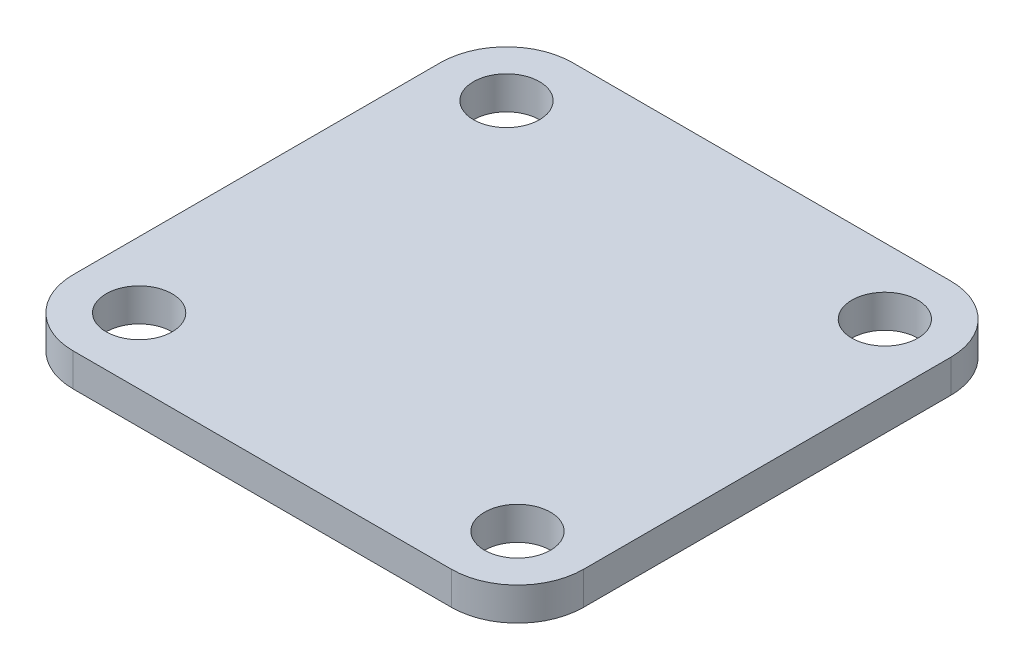
ISO-10303-21;
HEADER;
FILE_DESCRIPTION(('STEP AP214'),'2;1');
FILE_NAME('part.step','',(''),(''),'','','');
FILE_SCHEMA(('AUTOMOTIVE_DESIGN { 1 0 10303 214 1 1 1 1 }'));
ENDSEC;
DATA;
#1=APPLICATION_CONTEXT('core data for automotive mechanical design processes');
#2=APPLICATION_PROTOCOL_DEFINITION('international standard','automotive_design',2000,#1);
#3=PRODUCT_CONTEXT('',#1,'mechanical');
#4=PRODUCT('Part','Part','',(#3));
#5=PRODUCT_RELATED_PRODUCT_CATEGORY('part','',(#4));
#6=PRODUCT_DEFINITION_FORMATION('','',#4);
#7=PRODUCT_DEFINITION_CONTEXT('part definition',#1,'design');
#8=PRODUCT_DEFINITION('design','',#6,#7);
#9=PRODUCT_DEFINITION_SHAPE('','',#8);
#10=(LENGTH_UNIT() NAMED_UNIT(*) SI_UNIT(.MILLI.,.METRE.));
#11=(NAMED_UNIT(*) PLANE_ANGLE_UNIT() SI_UNIT($,.RADIAN.));
#12=(NAMED_UNIT(*) SI_UNIT($,.STERADIAN.) SOLID_ANGLE_UNIT());
#13=UNCERTAINTY_MEASURE_WITH_UNIT(LENGTH_MEASURE(1.E-05),#10,'distance_accuracy_value','');
#14=(GEOMETRIC_REPRESENTATION_CONTEXT(3) GLOBAL_UNCERTAINTY_ASSIGNED_CONTEXT((#13)) GLOBAL_UNIT_ASSIGNED_CONTEXT((#10,
#11,#12)) REPRESENTATION_CONTEXT('',''));
#15=CARTESIAN_POINT('',(0.,0.,0.));
#16=DIRECTION('',(0.,0.,1.));
#17=DIRECTION('',(1.,0.,0.));
#18=AXIS2_PLACEMENT_3D('',#15,#16,#17);
#19=CARTESIAN_POINT('',(11.6,1.5,-11.35));
#20=DIRECTION('',(-1.,0.,0.));
#21=DIRECTION('',(0.,0.,1.));
#22=AXIS2_PLACEMENT_3D('',#19,#20,#21);
#23=PLANE('',#22);
#24=DIRECTION('',(0.,0.,-1.));
#25=VECTOR('',#24,1.);
#26=CARTESIAN_POINT('',(11.6,0.,-11.35));
#27=LINE('',#26,#25);
#28=CARTESIAN_POINT('',(11.6,0.,8.35));
#29=VERTEX_POINT('',#28);
#30=CARTESIAN_POINT('',(11.6,0.,-8.35));
#31=VERTEX_POINT('',#30);
#32=EDGE_CURVE('E141',#29,#31,#27,.T.);
#33=ORIENTED_EDGE('',*,*,#32,.T.);
#34=DIRECTION('',(0.,-1.,0.));
#35=VECTOR('',#34,1.);
#36=CARTESIAN_POINT('',(11.6,1.5,-8.35));
#37=LINE('',#36,#35);
#38=CARTESIAN_POINT('',(11.6,1.5,-8.35));
#39=VERTEX_POINT('',#38);
#40=EDGE_CURVE('E174',#31,#39,#37,.F.);
#41=ORIENTED_EDGE('',*,*,#40,.T.);
#42=DIRECTION('',(0.,0.,-1.));
#43=VECTOR('',#42,1.);
#44=CARTESIAN_POINT('',(11.6,1.5,-11.35));
#45=LINE('',#44,#43);
#46=CARTESIAN_POINT('',(11.6,1.5,8.35));
#47=VERTEX_POINT('',#46);
#48=EDGE_CURVE('E139',#47,#39,#45,.T.);
#49=ORIENTED_EDGE('',*,*,#48,.F.);
#50=DIRECTION('',(0.,-1.,0.));
#51=VECTOR('',#50,1.);
#52=CARTESIAN_POINT('',(11.6,1.5,8.35));
#53=LINE('',#52,#51);
#54=EDGE_CURVE('E170',#47,#29,#53,.T.);
#55=ORIENTED_EDGE('',*,*,#54,.T.);
#56=EDGE_LOOP('',(#33,#41,#49,#55));
#57=FACE_BOUND('',#56,.T.);
#58=ADVANCED_FACE('F38',(#57),#23,.F.);
#59=CARTESIAN_POINT('',(-11.6,1.5,-11.35));
#60=DIRECTION('',(0.,0.,1.));
#61=DIRECTION('',(1.,0.,0.));
#62=AXIS2_PLACEMENT_3D('',#59,#60,#61);
#63=PLANE('',#62);
#64=DIRECTION('',(-1.,0.,0.));
#65=VECTOR('',#64,1.);
#66=CARTESIAN_POINT('',(-11.6,0.,-11.35));
#67=LINE('',#66,#65);
#68=CARTESIAN_POINT('',(8.59999999999999,0.,-11.35));
#69=VERTEX_POINT('',#68);
#70=CARTESIAN_POINT('',(-8.6,0.,-11.35));
#71=VERTEX_POINT('',#70);
#72=EDGE_CURVE('E135',#69,#71,#67,.T.);
#73=ORIENTED_EDGE('',*,*,#72,.T.);
#74=DIRECTION('',(0.,-1.,0.));
#75=VECTOR('',#74,1.);
#76=CARTESIAN_POINT('',(-8.6,1.5,-11.35));
#77=LINE('',#76,#75);
#78=CARTESIAN_POINT('',(-8.6,1.5,-11.35));
#79=VERTEX_POINT('',#78);
#80=EDGE_CURVE('E110',#71,#79,#77,.F.);
#81=ORIENTED_EDGE('',*,*,#80,.T.);
#82=DIRECTION('',(-1.,0.,0.));
#83=VECTOR('',#82,1.);
#84=CARTESIAN_POINT('',(-11.6,1.5,-11.35));
#85=LINE('',#84,#83);
#86=CARTESIAN_POINT('',(8.59999999999999,1.5,-11.35));
#87=VERTEX_POINT('',#86);
#88=EDGE_CURVE('E181',#87,#79,#85,.T.);
#89=ORIENTED_EDGE('',*,*,#88,.F.);
#90=DIRECTION('',(0.,-1.,0.));
#91=VECTOR('',#90,1.);
#92=CARTESIAN_POINT('',(8.59999999999999,1.5,-11.35));
#93=LINE('',#92,#91);
#94=EDGE_CURVE('E116',#87,#69,#93,.T.);
#95=ORIENTED_EDGE('',*,*,#94,.T.);
#96=EDGE_LOOP('',(#73,#81,#89,#95));
#97=FACE_BOUND('',#96,.T.);
#98=ADVANCED_FACE('F250',(#97),#63,.F.);
#99=CARTESIAN_POINT('',(-11.6,1.5,-11.35));
#100=DIRECTION('',(1.,0.,0.));
#101=DIRECTION('',(0.,0.,-1.));
#102=AXIS2_PLACEMENT_3D('',#99,#100,#101);
#103=PLANE('',#102);
#104=DIRECTION('',(0.,0.,1.));
#105=VECTOR('',#104,1.);
#106=CARTESIAN_POINT('',(-11.6,1.5,-11.35));
#107=LINE('',#106,#105);
#108=CARTESIAN_POINT('',(-11.6,1.5,-8.35));
#109=VERTEX_POINT('',#108);
#110=CARTESIAN_POINT('',(-11.6,1.5,8.35));
#111=VERTEX_POINT('',#110);
#112=EDGE_CURVE('E125',#109,#111,#107,.T.);
#113=ORIENTED_EDGE('',*,*,#112,.F.);
#114=DIRECTION('',(0.,-1.,0.));
#115=VECTOR('',#114,1.);
#116=CARTESIAN_POINT('',(-11.6,1.5,-8.35));
#117=LINE('',#116,#115);
#118=CARTESIAN_POINT('',(-11.6,0.,-8.35));
#119=VERTEX_POINT('',#118);
#120=EDGE_CURVE('E109',#109,#119,#117,.T.);
#121=ORIENTED_EDGE('',*,*,#120,.T.);
#122=DIRECTION('',(0.,0.,1.));
#123=VECTOR('',#122,1.);
#124=CARTESIAN_POINT('',(-11.6,0.,-11.35));
#125=LINE('',#124,#123);
#126=CARTESIAN_POINT('',(-11.6,0.,8.35));
#127=VERTEX_POINT('',#126);
#128=EDGE_CURVE('E123',#119,#127,#125,.T.);
#129=ORIENTED_EDGE('',*,*,#128,.T.);
#130=DIRECTION('',(0.,-1.,0.));
#131=VECTOR('',#130,1.);
#132=CARTESIAN_POINT('',(-11.6,1.5,8.35));
#133=LINE('',#132,#131);
#134=EDGE_CURVE('E128',#127,#111,#133,.F.);
#135=ORIENTED_EDGE('',*,*,#134,.T.);
#136=EDGE_LOOP('',(#113,#121,#129,#135));
#137=FACE_BOUND('',#136,.T.);
#138=ADVANCED_FACE('F122',(#137),#103,.F.);
#139=CARTESIAN_POINT('',(-11.6,1.5,11.35));
#140=DIRECTION('',(0.,0.,-1.));
#141=DIRECTION('',(-1.,0.,0.));
#142=AXIS2_PLACEMENT_3D('',#139,#140,#141);
#143=PLANE('',#142);
#144=DIRECTION('',(1.,0.,0.));
#145=VECTOR('',#144,1.);
#146=CARTESIAN_POINT('',(-11.6,1.5,11.35));
#147=LINE('',#146,#145);
#148=CARTESIAN_POINT('',(-8.6,1.5,11.35));
#149=VERTEX_POINT('',#148);
#150=CARTESIAN_POINT('',(8.6,1.5,11.35));
#151=VERTEX_POINT('',#150);
#152=EDGE_CURVE('E146',#149,#151,#147,.T.);
#153=ORIENTED_EDGE('',*,*,#152,.F.);
#154=DIRECTION('',(0.,-1.,0.));
#155=VECTOR('',#154,1.);
#156=CARTESIAN_POINT('',(-8.6,1.5,11.35));
#157=LINE('',#156,#155);
#158=CARTESIAN_POINT('',(-8.6,0.,11.35));
#159=VERTEX_POINT('',#158);
#160=EDGE_CURVE('E11',#149,#159,#157,.T.);
#161=ORIENTED_EDGE('',*,*,#160,.T.);
#162=DIRECTION('',(1.,0.,0.));
#163=VECTOR('',#162,1.);
#164=CARTESIAN_POINT('',(-11.6,0.,11.35));
#165=LINE('',#164,#163);
#166=CARTESIAN_POINT('',(8.6,0.,11.35));
#167=VERTEX_POINT('',#166);
#168=EDGE_CURVE('E134',#159,#167,#165,.T.);
#169=ORIENTED_EDGE('',*,*,#168,.T.);
#170=DIRECTION('',(0.,-1.,0.));
#171=VECTOR('',#170,1.);
#172=CARTESIAN_POINT('',(8.6,1.5,11.35));
#173=LINE('',#172,#171);
#174=EDGE_CURVE('E47',#167,#151,#173,.F.);
#175=ORIENTED_EDGE('',*,*,#174,.T.);
#176=EDGE_LOOP('',(#153,#161,#169,#175));
#177=FACE_BOUND('',#176,.T.);
#178=ADVANCED_FACE('F243',(#177),#143,.F.);
#179=CARTESIAN_POINT('',(0.,1.5,0.));
#180=DIRECTION('',(0.,1.,0.));
#181=DIRECTION('',(0.,0.,1.));
#182=AXIS2_PLACEMENT_3D('',#179,#180,#181);
#183=PLANE('',#182);
#184=CARTESIAN_POINT('',(-8.6,1.5,8.35));
#185=DIRECTION('',(0.,1.,0.));
#186=DIRECTION('',(0.,0.,1.));
#187=AXIS2_PLACEMENT_3D('',#184,#185,#186);
#188=CIRCLE('',#187,1.5);
#189=CARTESIAN_POINT('',(-8.6,1.5,9.85));
#190=VERTEX_POINT('',#189);
#191=EDGE_CURVE('E207',#190,#190,#188,.T.);
#192=ORIENTED_EDGE('',*,*,#191,.F.);
#193=EDGE_LOOP('',(#192));
#194=FACE_BOUND('',#193,.T.);
#195=CARTESIAN_POINT('',(8.6,1.5,8.35));
#196=DIRECTION('',(0.,1.,0.));
#197=DIRECTION('',(0.,0.,1.));
#198=AXIS2_PLACEMENT_3D('',#195,#196,#197);
#199=CIRCLE('',#198,1.5);
#200=CARTESIAN_POINT('',(8.6,1.5,9.85));
#201=VERTEX_POINT('',#200);
#202=EDGE_CURVE('E215',#201,#201,#199,.T.);
#203=ORIENTED_EDGE('',*,*,#202,.F.);
#204=EDGE_LOOP('',(#203));
#205=FACE_BOUND('',#204,.T.);
#206=CARTESIAN_POINT('',(8.59999999999999,1.5,-8.35));
#207=DIRECTION('',(0.,1.,0.));
#208=DIRECTION('',(0.,0.,1.));
#209=AXIS2_PLACEMENT_3D('',#206,#207,#208);
#210=CIRCLE('',#209,1.5);
#211=CARTESIAN_POINT('',(8.59999999999999,1.5,-6.85));
#212=VERTEX_POINT('',#211);
#213=EDGE_CURVE('E223',#212,#212,#210,.T.);
#214=ORIENTED_EDGE('',*,*,#213,.F.);
#215=EDGE_LOOP('',(#214));
#216=FACE_BOUND('',#215,.T.);
#217=CARTESIAN_POINT('',(-8.6,1.5,-8.35));
#218=DIRECTION('',(0.,1.,0.));
#219=DIRECTION('',(0.,0.,1.));
#220=AXIS2_PLACEMENT_3D('',#217,#218,#219);
#221=CIRCLE('',#220,1.5);
#222=CARTESIAN_POINT('',(-8.6,1.5,-6.85));
#223=VERTEX_POINT('',#222);
#224=EDGE_CURVE('E191',#223,#223,#221,.T.);
#225=ORIENTED_EDGE('',*,*,#224,.F.);
#226=EDGE_LOOP('',(#225));
#227=FACE_BOUND('',#226,.T.);
#228=ORIENTED_EDGE('',*,*,#88,.T.);
#229=CARTESIAN_POINT('',(-8.6,1.5,-8.35));
#230=DIRECTION('',(0.,1.,0.));
#231=DIRECTION('',(0.,0.,1.));
#232=AXIS2_PLACEMENT_3D('',#229,#230,#231);
#233=CIRCLE('',#232,3.);
#234=EDGE_CURVE('E167',#79,#109,#233,.T.);
#235=ORIENTED_EDGE('',*,*,#234,.T.);
#236=ORIENTED_EDGE('',*,*,#112,.T.);
#237=CARTESIAN_POINT('',(-8.6,1.5,8.35));
#238=DIRECTION('',(0.,1.,0.));
#239=DIRECTION('',(0.,0.,1.));
#240=AXIS2_PLACEMENT_3D('',#237,#238,#239);
#241=CIRCLE('',#240,3.);
#242=EDGE_CURVE('E60',#111,#149,#241,.T.);
#243=ORIENTED_EDGE('',*,*,#242,.T.);
#244=ORIENTED_EDGE('',*,*,#152,.T.);
#245=CARTESIAN_POINT('',(8.6,1.5,8.35));
#246=DIRECTION('',(0.,1.,0.));
#247=DIRECTION('',(0.,0.,1.));
#248=AXIS2_PLACEMENT_3D('',#245,#246,#247);
#249=CIRCLE('',#248,3.);
#250=EDGE_CURVE('E159',#151,#47,#249,.T.);
#251=ORIENTED_EDGE('',*,*,#250,.T.);
#252=ORIENTED_EDGE('',*,*,#48,.T.);
#253=CARTESIAN_POINT('',(8.59999999999999,1.5,-8.35));
#254=DIRECTION('',(0.,1.,0.));
#255=DIRECTION('',(0.,0.,1.));
#256=AXIS2_PLACEMENT_3D('',#253,#254,#255);
#257=CIRCLE('',#256,3.);
#258=EDGE_CURVE('E164',#39,#87,#257,.T.);
#259=ORIENTED_EDGE('',*,*,#258,.T.);
#260=EDGE_LOOP('',(#228,#235,#236,#243,#244,#251,#252,#259));
#261=FACE_BOUND('',#260,.T.);
#262=ADVANCED_FACE('F240',(#194,#205,#216,#227,#261),#183,.T.);
#263=CARTESIAN_POINT('',(0.,0.,0.));
#264=DIRECTION('',(0.,1.,0.));
#265=DIRECTION('',(0.,0.,1.));
#266=AXIS2_PLACEMENT_3D('',#263,#264,#265);
#267=PLANE('',#266);
#268=CARTESIAN_POINT('',(-8.6,0.,8.35));
#269=DIRECTION('',(0.,1.,0.));
#270=DIRECTION('',(0.,0.,1.));
#271=AXIS2_PLACEMENT_3D('',#268,#269,#270);
#272=CIRCLE('',#271,1.5);
#273=CARTESIAN_POINT('',(-8.6,0.,9.85));
#274=VERTEX_POINT('',#273);
#275=EDGE_CURVE('E211',#274,#274,#272,.T.);
#276=ORIENTED_EDGE('',*,*,#275,.T.);
#277=EDGE_LOOP('',(#276));
#278=FACE_BOUND('',#277,.T.);
#279=CARTESIAN_POINT('',(8.6,0.,8.35));
#280=DIRECTION('',(0.,1.,0.));
#281=DIRECTION('',(0.,0.,1.));
#282=AXIS2_PLACEMENT_3D('',#279,#280,#281);
#283=CIRCLE('',#282,1.5);
#284=CARTESIAN_POINT('',(8.6,0.,9.85));
#285=VERTEX_POINT('',#284);
#286=EDGE_CURVE('E219',#285,#285,#283,.T.);
#287=ORIENTED_EDGE('',*,*,#286,.T.);
#288=EDGE_LOOP('',(#287));
#289=FACE_BOUND('',#288,.T.);
#290=CARTESIAN_POINT('',(8.59999999999999,0.,-8.35));
#291=DIRECTION('',(0.,1.,0.));
#292=DIRECTION('',(0.,0.,1.));
#293=AXIS2_PLACEMENT_3D('',#290,#291,#292);
#294=CIRCLE('',#293,1.5);
#295=CARTESIAN_POINT('',(8.59999999999999,0.,-6.85));
#296=VERTEX_POINT('',#295);
#297=EDGE_CURVE('E205',#296,#296,#294,.T.);
#298=ORIENTED_EDGE('',*,*,#297,.T.);
#299=EDGE_LOOP('',(#298));
#300=FACE_BOUND('',#299,.T.);
#301=CARTESIAN_POINT('',(-8.6,0.,-8.35));
#302=DIRECTION('',(0.,1.,0.));
#303=DIRECTION('',(0.,0.,1.));
#304=AXIS2_PLACEMENT_3D('',#301,#302,#303);
#305=CIRCLE('',#304,1.5);
#306=CARTESIAN_POINT('',(-8.6,0.,-6.85));
#307=VERTEX_POINT('',#306);
#308=EDGE_CURVE('E195',#307,#307,#305,.T.);
#309=ORIENTED_EDGE('',*,*,#308,.T.);
#310=EDGE_LOOP('',(#309));
#311=FACE_BOUND('',#310,.T.);
#312=ORIENTED_EDGE('',*,*,#128,.F.);
#313=CARTESIAN_POINT('',(-8.6,0.,-8.35));
#314=DIRECTION('',(0.,1.,0.));
#315=DIRECTION('',(0.,0.,1.));
#316=AXIS2_PLACEMENT_3D('',#313,#314,#315);
#317=CIRCLE('',#316,3.);
#318=EDGE_CURVE('E105',#119,#71,#317,.F.);
#319=ORIENTED_EDGE('',*,*,#318,.T.);
#320=ORIENTED_EDGE('',*,*,#72,.F.);
#321=CARTESIAN_POINT('',(8.59999999999999,0.,-8.35));
#322=DIRECTION('',(0.,1.,0.));
#323=DIRECTION('',(0.,0.,1.));
#324=AXIS2_PLACEMENT_3D('',#321,#322,#323);
#325=CIRCLE('',#324,3.);
#326=EDGE_CURVE('E117',#69,#31,#325,.F.);
#327=ORIENTED_EDGE('',*,*,#326,.T.);
#328=ORIENTED_EDGE('',*,*,#32,.F.);
#329=CARTESIAN_POINT('',(8.6,0.,8.35));
#330=DIRECTION('',(0.,1.,0.));
#331=DIRECTION('',(0.,0.,1.));
#332=AXIS2_PLACEMENT_3D('',#329,#330,#331);
#333=CIRCLE('',#332,3.);
#334=EDGE_CURVE('E127',#29,#167,#333,.F.);
#335=ORIENTED_EDGE('',*,*,#334,.T.);
#336=ORIENTED_EDGE('',*,*,#168,.F.);
#337=CARTESIAN_POINT('',(-8.6,0.,8.35));
#338=DIRECTION('',(0.,1.,0.));
#339=DIRECTION('',(0.,0.,1.));
#340=AXIS2_PLACEMENT_3D('',#337,#338,#339);
#341=CIRCLE('',#340,3.);
#342=EDGE_CURVE('E132',#159,#127,#341,.F.);
#343=ORIENTED_EDGE('',*,*,#342,.T.);
#344=EDGE_LOOP('',(#312,#319,#320,#327,#328,#335,#336,#343));
#345=FACE_BOUND('',#344,.T.);
#346=ADVANCED_FACE('F130',(#278,#289,#300,#311,#345),#267,.F.);
#347=CARTESIAN_POINT('',(-8.6,1.5,-8.35));
#348=DIRECTION('',(0.,-1.,0.));
#349=DIRECTION('',(0.,0.,-1.));
#350=AXIS2_PLACEMENT_3D('',#347,#348,#349);
#351=CYLINDRICAL_SURFACE('',#350,3.);
#352=ORIENTED_EDGE('',*,*,#234,.F.);
#353=ORIENTED_EDGE('',*,*,#80,.F.);
#354=ORIENTED_EDGE('',*,*,#318,.F.);
#355=ORIENTED_EDGE('',*,*,#120,.F.);
#356=EDGE_LOOP('',(#352,#353,#354,#355));
#357=FACE_BOUND('',#356,.T.);
#358=ADVANCED_FACE('F108',(#357),#351,.T.);
#359=CARTESIAN_POINT('',(8.59999999999999,1.5,-8.35));
#360=DIRECTION('',(0.,-1.,0.));
#361=DIRECTION('',(0.,0.,-1.));
#362=AXIS2_PLACEMENT_3D('',#359,#360,#361);
#363=CYLINDRICAL_SURFACE('',#362,3.);
#364=ORIENTED_EDGE('',*,*,#258,.F.);
#365=ORIENTED_EDGE('',*,*,#40,.F.);
#366=ORIENTED_EDGE('',*,*,#326,.F.);
#367=ORIENTED_EDGE('',*,*,#94,.F.);
#368=EDGE_LOOP('',(#364,#365,#366,#367));
#369=FACE_BOUND('',#368,.T.);
#370=ADVANCED_FACE('F252',(#369),#363,.T.);
#371=CARTESIAN_POINT('',(-8.6,1.5,8.35));
#372=DIRECTION('',(0.,-1.,0.));
#373=DIRECTION('',(0.,0.,-1.));
#374=AXIS2_PLACEMENT_3D('',#371,#372,#373);
#375=CYLINDRICAL_SURFACE('',#374,3.);
#376=ORIENTED_EDGE('',*,*,#242,.F.);
#377=ORIENTED_EDGE('',*,*,#134,.F.);
#378=ORIENTED_EDGE('',*,*,#342,.F.);
#379=ORIENTED_EDGE('',*,*,#160,.F.);
#380=EDGE_LOOP('',(#376,#377,#378,#379));
#381=FACE_BOUND('',#380,.T.);
#382=ADVANCED_FACE('F268',(#381),#375,.T.);
#383=CARTESIAN_POINT('',(8.6,1.5,8.35));
#384=DIRECTION('',(0.,-1.,0.));
#385=DIRECTION('',(0.,0.,-1.));
#386=AXIS2_PLACEMENT_3D('',#383,#384,#385);
#387=CYLINDRICAL_SURFACE('',#386,3.);
#388=ORIENTED_EDGE('',*,*,#250,.F.);
#389=ORIENTED_EDGE('',*,*,#174,.F.);
#390=ORIENTED_EDGE('',*,*,#334,.F.);
#391=ORIENTED_EDGE('',*,*,#54,.F.);
#392=EDGE_LOOP('',(#388,#389,#390,#391));
#393=FACE_BOUND('',#392,.T.);
#394=ADVANCED_FACE('F40',(#393),#387,.T.);
#395=CARTESIAN_POINT('',(-8.6,0.,-8.35));
#396=DIRECTION('',(0.,1.,0.));
#397=DIRECTION('',(0.,0.,1.));
#398=AXIS2_PLACEMENT_3D('',#395,#396,#397);
#399=CYLINDRICAL_SURFACE('',#398,1.5);
#400=ORIENTED_EDGE('',*,*,#308,.F.);
#401=EDGE_LOOP('',(#400));
#402=FACE_BOUND('',#401,.T.);
#403=ORIENTED_EDGE('',*,*,#224,.T.);
#404=EDGE_LOOP('',(#403));
#405=FACE_BOUND('',#404,.T.);
#406=ADVANCED_FACE('F236',(#402,#405),#399,.F.);
#407=CARTESIAN_POINT('',(8.59999999999999,0.,-8.35));
#408=DIRECTION('',(0.,1.,0.));
#409=DIRECTION('',(0.,0.,1.));
#410=AXIS2_PLACEMENT_3D('',#407,#408,#409);
#411=CYLINDRICAL_SURFACE('',#410,1.5);
#412=ORIENTED_EDGE('',*,*,#297,.F.);
#413=EDGE_LOOP('',(#412));
#414=FACE_BOUND('',#413,.T.);
#415=ORIENTED_EDGE('',*,*,#213,.T.);
#416=EDGE_LOOP('',(#415));
#417=FACE_BOUND('',#416,.T.);
#418=ADVANCED_FACE('F232',(#414,#417),#411,.F.);
#419=CARTESIAN_POINT('',(8.6,0.,8.35));
#420=DIRECTION('',(0.,1.,0.));
#421=DIRECTION('',(0.,0.,1.));
#422=AXIS2_PLACEMENT_3D('',#419,#420,#421);
#423=CYLINDRICAL_SURFACE('',#422,1.5);
#424=ORIENTED_EDGE('',*,*,#286,.F.);
#425=EDGE_LOOP('',(#424));
#426=FACE_BOUND('',#425,.T.);
#427=ORIENTED_EDGE('',*,*,#202,.T.);
#428=EDGE_LOOP('',(#427));
#429=FACE_BOUND('',#428,.T.);
#430=ADVANCED_FACE('F235',(#426,#429),#423,.F.);
#431=CARTESIAN_POINT('',(-8.6,0.,8.35));
#432=DIRECTION('',(0.,1.,0.));
#433=DIRECTION('',(0.,0.,1.));
#434=AXIS2_PLACEMENT_3D('',#431,#432,#433);
#435=CYLINDRICAL_SURFACE('',#434,1.5);
#436=ORIENTED_EDGE('',*,*,#275,.F.);
#437=EDGE_LOOP('',(#436));
#438=FACE_BOUND('',#437,.T.);
#439=ORIENTED_EDGE('',*,*,#191,.T.);
#440=EDGE_LOOP('',(#439));
#441=FACE_BOUND('',#440,.T.);
#442=ADVANCED_FACE('F283',(#438,#441),#435,.F.);
#443=CLOSED_SHELL('',(#58,#98,#138,#178,#262,#346,#358,#370,#382,#394,#406,#418,#430,#442));
#444=MANIFOLD_SOLID_BREP('B2',#443);
#445=ADVANCED_BREP_SHAPE_REPRESENTATION('',(#18,#444),#14);
#446=SHAPE_DEFINITION_REPRESENTATION(#9,#445);
ENDSEC;
END-ISO-10303-21;
